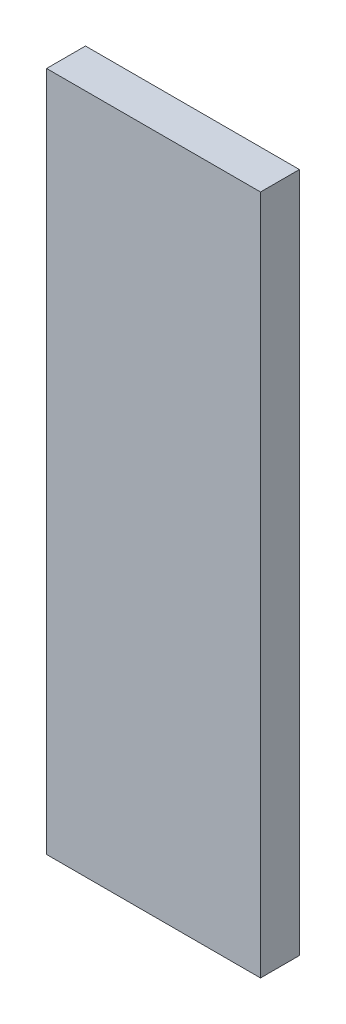
ISO-10303-21;
HEADER;
FILE_DESCRIPTION(('STEP AP214'),'2;1');
FILE_NAME('part.step','',(''),(''),'','','');
FILE_SCHEMA(('AUTOMOTIVE_DESIGN { 1 0 10303 214 1 1 1 1 }'));
ENDSEC;
DATA;
#1=APPLICATION_CONTEXT('core data for automotive mechanical design processes');
#2=APPLICATION_PROTOCOL_DEFINITION('international standard','automotive_design',2000,#1);
#3=PRODUCT_CONTEXT('',#1,'mechanical');
#4=PRODUCT('Part','Part','',(#3));
#5=PRODUCT_RELATED_PRODUCT_CATEGORY('part','',(#4));
#6=PRODUCT_DEFINITION_FORMATION('','',#4);
#7=PRODUCT_DEFINITION_CONTEXT('part definition',#1,'design');
#8=PRODUCT_DEFINITION('design','',#6,#7);
#9=PRODUCT_DEFINITION_SHAPE('','',#8);
#10=(LENGTH_UNIT() NAMED_UNIT(*) SI_UNIT(.MILLI.,.METRE.));
#11=(NAMED_UNIT(*) PLANE_ANGLE_UNIT() SI_UNIT($,.RADIAN.));
#12=(NAMED_UNIT(*) SI_UNIT($,.STERADIAN.) SOLID_ANGLE_UNIT());
#13=UNCERTAINTY_MEASURE_WITH_UNIT(LENGTH_MEASURE(1.E-05),#10,'distance_accuracy_value','');
#14=(GEOMETRIC_REPRESENTATION_CONTEXT(3) GLOBAL_UNCERTAINTY_ASSIGNED_CONTEXT((#13)) GLOBAL_UNIT_ASSIGNED_CONTEXT((#10,
#11,#12)) REPRESENTATION_CONTEXT('',''));
#15=CARTESIAN_POINT('',(0.,0.,0.));
#16=DIRECTION('',(0.,0.,1.));
#17=DIRECTION('',(1.,0.,0.));
#18=AXIS2_PLACEMENT_3D('',#15,#16,#17);
#19=CARTESIAN_POINT('',(-27.94,-88.9,5.08));
#20=DIRECTION('',(1.,0.,0.));
#21=DIRECTION('',(0.,0.,-1.));
#22=AXIS2_PLACEMENT_3D('',#19,#20,#21);
#23=PLANE('',#22);
#24=DIRECTION('',(0.,-1.,0.));
#25=VECTOR('',#24,1.);
#26=CARTESIAN_POINT('',(-27.94,-88.9,-5.08));
#27=LINE('',#26,#25);
#28=CARTESIAN_POINT('',(-27.94,88.9,-5.08));
#29=VERTEX_POINT('',#28);
#30=CARTESIAN_POINT('',(-27.94,-88.9,-5.08));
#31=VERTEX_POINT('',#30);
#32=EDGE_CURVE('E107',#29,#31,#27,.T.);
#33=ORIENTED_EDGE('',*,*,#32,.T.);
#34=DIRECTION('',(0.,0.,-1.));
#35=VECTOR('',#34,1.);
#36=CARTESIAN_POINT('',(-27.94,-88.9,5.08));
#37=LINE('',#36,#35);
#38=CARTESIAN_POINT('',(-27.94,-88.9,5.08));
#39=VERTEX_POINT('',#38);
#40=EDGE_CURVE('E11',#39,#31,#37,.T.);
#41=ORIENTED_EDGE('',*,*,#40,.F.);
#42=DIRECTION('',(0.,-1.,0.));
#43=VECTOR('',#42,1.);
#44=CARTESIAN_POINT('',(-27.94,-88.9,5.08));
#45=LINE('',#44,#43);
#46=CARTESIAN_POINT('',(-27.94,88.9,5.08));
#47=VERTEX_POINT('',#46);
#48=EDGE_CURVE('E91',#47,#39,#45,.T.);
#49=ORIENTED_EDGE('',*,*,#48,.F.);
#50=DIRECTION('',(0.,0.,-1.));
#51=VECTOR('',#50,1.);
#52=CARTESIAN_POINT('',(-27.94,88.9,5.08));
#53=LINE('',#52,#51);
#54=EDGE_CURVE('E103',#47,#29,#53,.T.);
#55=ORIENTED_EDGE('',*,*,#54,.T.);
#56=EDGE_LOOP('',(#33,#41,#49,#55));
#57=FACE_BOUND('',#56,.T.);
#58=ADVANCED_FACE('F39',(#57),#23,.F.);
#59=CARTESIAN_POINT('',(27.94,-88.9,5.08));
#60=DIRECTION('',(0.,1.,0.));
#61=DIRECTION('',(0.,0.,1.));
#62=AXIS2_PLACEMENT_3D('',#59,#60,#61);
#63=PLANE('',#62);
#64=DIRECTION('',(1.,0.,0.));
#65=VECTOR('',#64,1.);
#66=CARTESIAN_POINT('',(27.94,-88.9,-5.08));
#67=LINE('',#66,#65);
#68=CARTESIAN_POINT('',(27.94,-88.9,-5.08));
#69=VERTEX_POINT('',#68);
#70=EDGE_CURVE('E96',#31,#69,#67,.T.);
#71=ORIENTED_EDGE('',*,*,#70,.T.);
#72=DIRECTION('',(0.,0.,-1.));
#73=VECTOR('',#72,1.);
#74=CARTESIAN_POINT('',(27.94,-88.9,5.08));
#75=LINE('',#74,#73);
#76=CARTESIAN_POINT('',(27.94,-88.9,5.08));
#77=VERTEX_POINT('',#76);
#78=EDGE_CURVE('E48',#77,#69,#75,.T.);
#79=ORIENTED_EDGE('',*,*,#78,.F.);
#80=DIRECTION('',(1.,0.,0.));
#81=VECTOR('',#80,1.);
#82=CARTESIAN_POINT('',(27.94,-88.9,5.08));
#83=LINE('',#82,#81);
#84=EDGE_CURVE('E86',#39,#77,#83,.T.);
#85=ORIENTED_EDGE('',*,*,#84,.F.);
#86=ORIENTED_EDGE('',*,*,#40,.T.);
#87=EDGE_LOOP('',(#71,#79,#85,#86));
#88=FACE_BOUND('',#87,.T.);
#89=ADVANCED_FACE('F95',(#88),#63,.F.);
#90=CARTESIAN_POINT('',(27.94,-88.9,5.08));
#91=DIRECTION('',(-1.,0.,0.));
#92=DIRECTION('',(0.,-1.,0.));
#93=AXIS2_PLACEMENT_3D('',#90,#91,#92);
#94=PLANE('',#93);
#95=DIRECTION('',(0.,1.,0.));
#96=VECTOR('',#95,1.);
#97=CARTESIAN_POINT('',(27.94,-88.9,-5.08));
#98=LINE('',#97,#96);
#99=CARTESIAN_POINT('',(27.94,88.9,-5.08));
#100=VERTEX_POINT('',#99);
#101=EDGE_CURVE('E73',#69,#100,#98,.T.);
#102=ORIENTED_EDGE('',*,*,#101,.T.);
#103=DIRECTION('',(0.,0.,-1.));
#104=VECTOR('',#103,1.);
#105=CARTESIAN_POINT('',(27.94,88.9,5.08));
#106=LINE('',#105,#104);
#107=CARTESIAN_POINT('',(27.94,88.9,5.08));
#108=VERTEX_POINT('',#107);
#109=EDGE_CURVE('E98',#108,#100,#106,.T.);
#110=ORIENTED_EDGE('',*,*,#109,.F.);
#111=DIRECTION('',(0.,1.,0.));
#112=VECTOR('',#111,1.);
#113=CARTESIAN_POINT('',(27.94,-88.9,5.08));
#114=LINE('',#113,#112);
#115=EDGE_CURVE('E89',#77,#108,#114,.T.);
#116=ORIENTED_EDGE('',*,*,#115,.F.);
#117=ORIENTED_EDGE('',*,*,#78,.T.);
#118=EDGE_LOOP('',(#102,#110,#116,#117));
#119=FACE_BOUND('',#118,.T.);
#120=ADVANCED_FACE('F99',(#119),#94,.F.);
#121=CARTESIAN_POINT('',(27.94,88.9,5.08));
#122=DIRECTION('',(0.,-1.,0.));
#123=DIRECTION('',(1.,0.,0.));
#124=AXIS2_PLACEMENT_3D('',#121,#122,#123);
#125=PLANE('',#124);
#126=DIRECTION('',(-1.,0.,0.));
#127=VECTOR('',#126,1.);
#128=CARTESIAN_POINT('',(27.94,88.9,-5.08));
#129=LINE('',#128,#127);
#130=EDGE_CURVE('E79',#100,#29,#129,.T.);
#131=ORIENTED_EDGE('',*,*,#130,.T.);
#132=ORIENTED_EDGE('',*,*,#54,.F.);
#133=DIRECTION('',(-1.,0.,0.));
#134=VECTOR('',#133,1.);
#135=CARTESIAN_POINT('',(27.94,88.9,5.08));
#136=LINE('',#135,#134);
#137=EDGE_CURVE('E56',#108,#47,#136,.T.);
#138=ORIENTED_EDGE('',*,*,#137,.F.);
#139=ORIENTED_EDGE('',*,*,#109,.T.);
#140=EDGE_LOOP('',(#131,#132,#138,#139));
#141=FACE_BOUND('',#140,.T.);
#142=ADVANCED_FACE('F120',(#141),#125,.F.);
#143=CARTESIAN_POINT('',(0.,0.,5.08));
#144=DIRECTION('',(0.,0.,1.));
#145=DIRECTION('',(1.,0.,0.));
#146=AXIS2_PLACEMENT_3D('',#143,#144,#145);
#147=PLANE('',#146);
#148=ORIENTED_EDGE('',*,*,#48,.T.);
#149=ORIENTED_EDGE('',*,*,#84,.T.);
#150=ORIENTED_EDGE('',*,*,#115,.T.);
#151=ORIENTED_EDGE('',*,*,#137,.T.);
#152=EDGE_LOOP('',(#148,#149,#150,#151));
#153=FACE_BOUND('',#152,.T.);
#154=ADVANCED_FACE('F87',(#153),#147,.T.);
#155=CARTESIAN_POINT('',(0.,0.,-5.08));
#156=DIRECTION('',(0.,0.,1.));
#157=DIRECTION('',(1.,0.,0.));
#158=AXIS2_PLACEMENT_3D('',#155,#156,#157);
#159=PLANE('',#158);
#160=ORIENTED_EDGE('',*,*,#32,.F.);
#161=ORIENTED_EDGE('',*,*,#130,.F.);
#162=ORIENTED_EDGE('',*,*,#101,.F.);
#163=ORIENTED_EDGE('',*,*,#70,.F.);
#164=EDGE_LOOP('',(#160,#161,#162,#163));
#165=FACE_BOUND('',#164,.T.);
#166=ADVANCED_FACE('F123',(#165),#159,.F.);
#167=CLOSED_SHELL('',(#58,#89,#120,#142,#154,#166));
#168=MANIFOLD_SOLID_BREP('B2',#167);
#169=ADVANCED_BREP_SHAPE_REPRESENTATION('',(#18,#168),#14);
#170=SHAPE_DEFINITION_REPRESENTATION(#9,#169);
ENDSEC;
END-ISO-10303-21;
